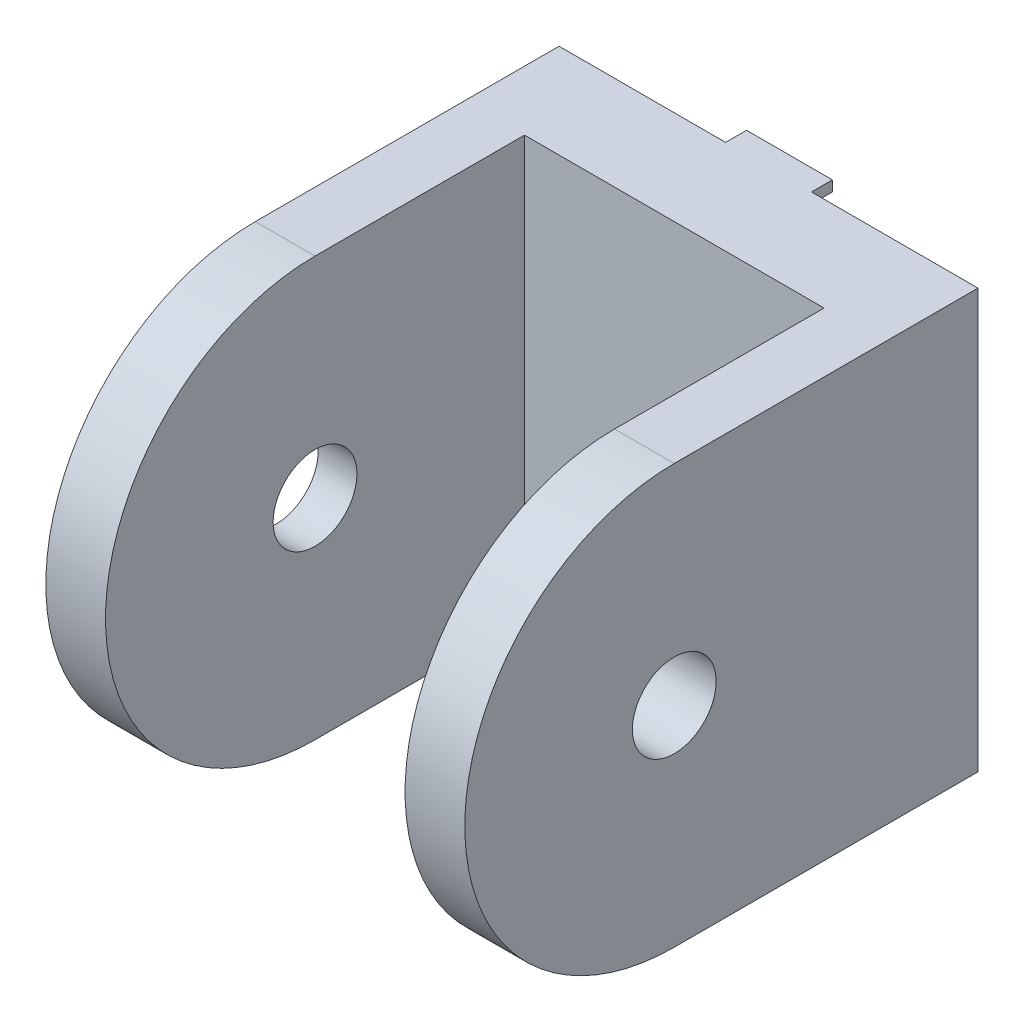
ISO-10303-21;
HEADER;
FILE_DESCRIPTION(('STEP AP214'),'2;1');
FILE_NAME('part.step','',(''),(''),'','','');
FILE_SCHEMA(('AUTOMOTIVE_DESIGN { 1 0 10303 214 1 1 1 1 }'));
ENDSEC;
DATA;
#1=APPLICATION_CONTEXT('core data for automotive mechanical design processes');
#2=APPLICATION_PROTOCOL_DEFINITION('international standard','automotive_design',2000,#1);
#3=PRODUCT_CONTEXT('',#1,'mechanical');
#4=PRODUCT('Part','Part','',(#3));
#5=PRODUCT_RELATED_PRODUCT_CATEGORY('part','',(#4));
#6=PRODUCT_DEFINITION_FORMATION('','',#4);
#7=PRODUCT_DEFINITION_CONTEXT('part definition',#1,'design');
#8=PRODUCT_DEFINITION('design','',#6,#7);
#9=PRODUCT_DEFINITION_SHAPE('','',#8);
#10=(LENGTH_UNIT() NAMED_UNIT(*) SI_UNIT(.MILLI.,.METRE.));
#11=(NAMED_UNIT(*) PLANE_ANGLE_UNIT() SI_UNIT($,.RADIAN.));
#12=(NAMED_UNIT(*) SI_UNIT($,.STERADIAN.) SOLID_ANGLE_UNIT());
#13=UNCERTAINTY_MEASURE_WITH_UNIT(LENGTH_MEASURE(1.E-05),#10,'distance_accuracy_value','');
#14=(GEOMETRIC_REPRESENTATION_CONTEXT(3) GLOBAL_UNCERTAINTY_ASSIGNED_CONTEXT((#13)) GLOBAL_UNIT_ASSIGNED_CONTEXT((#10,
#11,#12)) REPRESENTATION_CONTEXT('',''));
#15=CARTESIAN_POINT('',(0.,0.,0.));
#16=DIRECTION('',(0.,0.,1.));
#17=DIRECTION('',(1.,0.,0.));
#18=AXIS2_PLACEMENT_3D('',#15,#16,#17);
#19=CARTESIAN_POINT('',(20.,20.,0.));
#20=DIRECTION('',(0.,0.,-1.));
#21=DIRECTION('',(-1.,0.,0.));
#22=AXIS2_PLACEMENT_3D('',#19,#20,#21);
#23=PLANE('',#22);
#24=CARTESIAN_POINT('',(0.,0.,0.));
#25=DIRECTION('',(0.,0.,1.));
#26=DIRECTION('',(1.,0.,0.));
#27=AXIS2_PLACEMENT_3D('',#24,#25,#26);
#28=CIRCLE('',#27,4.);
#29=CARTESIAN_POINT('',(4.,0.,0.));
#30=VERTEX_POINT('',#29);
#31=EDGE_CURVE('E279',#30,#30,#28,.T.);
#32=ORIENTED_EDGE('',*,*,#31,.T.);
#33=EDGE_LOOP('',(#32));
#34=FACE_BOUND('',#33,.T.);
#35=DIRECTION('',(1.,0.,0.));
#36=VECTOR('',#35,1.);
#37=CARTESIAN_POINT('',(4.1,-19.,0.));
#38=LINE('',#37,#36);
#39=CARTESIAN_POINT('',(-4.1,-19.,0.));
#40=VERTEX_POINT('',#39);
#41=CARTESIAN_POINT('',(4.1,-19.,0.));
#42=VERTEX_POINT('',#41);
#43=EDGE_CURVE('E340',#40,#42,#38,.T.);
#44=ORIENTED_EDGE('',*,*,#43,.F.);
#45=DIRECTION('',(0.,1.,0.));
#46=VECTOR('',#45,1.);
#47=CARTESIAN_POINT('',(-4.1,-20.,0.));
#48=LINE('',#47,#46);
#49=CARTESIAN_POINT('',(-4.1,-20.,0.));
#50=VERTEX_POINT('',#49);
#51=EDGE_CURVE('E338',#50,#40,#48,.T.);
#52=ORIENTED_EDGE('',*,*,#51,.F.);
#53=DIRECTION('',(1.,0.,0.));
#54=VECTOR('',#53,1.);
#55=CARTESIAN_POINT('',(-20.,-20.,0.));
#56=LINE('',#55,#54);
#57=CARTESIAN_POINT('',(-20.,-20.,0.));
#58=VERTEX_POINT('',#57);
#59=EDGE_CURVE('E174',#58,#50,#56,.T.);
#60=ORIENTED_EDGE('',*,*,#59,.F.);
#61=DIRECTION('',(0.,-1.,0.));
#62=VECTOR('',#61,1.);
#63=CARTESIAN_POINT('',(-20.,-20.,0.));
#64=LINE('',#63,#62);
#65=CARTESIAN_POINT('',(-20.,20.,0.));
#66=VERTEX_POINT('',#65);
#67=EDGE_CURVE('E227',#66,#58,#64,.T.);
#68=ORIENTED_EDGE('',*,*,#67,.F.);
#69=DIRECTION('',(-1.,0.,0.));
#70=VECTOR('',#69,1.);
#71=CARTESIAN_POINT('',(-20.,20.,0.));
#72=LINE('',#71,#70);
#73=CARTESIAN_POINT('',(-4.1,20.,0.));
#74=VERTEX_POINT('',#73);
#75=EDGE_CURVE('E217',#74,#66,#72,.T.);
#76=ORIENTED_EDGE('',*,*,#75,.F.);
#77=DIRECTION('',(0.,1.,0.));
#78=VECTOR('',#77,1.);
#79=CARTESIAN_POINT('',(-4.1,20.,0.));
#80=LINE('',#79,#78);
#81=CARTESIAN_POINT('',(-4.1,19.,0.));
#82=VERTEX_POINT('',#81);
#83=EDGE_CURVE('E186',#82,#74,#80,.T.);
#84=ORIENTED_EDGE('',*,*,#83,.F.);
#85=DIRECTION('',(-1.,0.,0.));
#86=VECTOR('',#85,1.);
#87=CARTESIAN_POINT('',(4.1,19.,0.));
#88=LINE('',#87,#86);
#89=CARTESIAN_POINT('',(4.1,19.,0.));
#90=VERTEX_POINT('',#89);
#91=EDGE_CURVE('E60',#90,#82,#88,.T.);
#92=ORIENTED_EDGE('',*,*,#91,.F.);
#93=DIRECTION('',(0.,-1.,0.));
#94=VECTOR('',#93,1.);
#95=CARTESIAN_POINT('',(4.1,20.,0.));
#96=LINE('',#95,#94);
#97=CARTESIAN_POINT('',(4.1,20.,0.));
#98=VERTEX_POINT('',#97);
#99=EDGE_CURVE('E175',#98,#90,#96,.T.);
#100=ORIENTED_EDGE('',*,*,#99,.F.);
#101=CARTESIAN_POINT('',(20.,20.,0.));
#102=VERTEX_POINT('',#101);
#103=EDGE_CURVE('E220',#102,#98,#72,.T.);
#104=ORIENTED_EDGE('',*,*,#103,.F.);
#105=DIRECTION('',(0.,1.,0.));
#106=VECTOR('',#105,1.);
#107=CARTESIAN_POINT('',(20.,-20.,0.));
#108=LINE('',#107,#106);
#109=CARTESIAN_POINT('',(20.,-20.,0.));
#110=VERTEX_POINT('',#109);
#111=EDGE_CURVE('E221',#110,#102,#108,.T.);
#112=ORIENTED_EDGE('',*,*,#111,.F.);
#113=CARTESIAN_POINT('',(4.1,-20.,0.));
#114=VERTEX_POINT('',#113);
#115=EDGE_CURVE('E231',#114,#110,#56,.T.);
#116=ORIENTED_EDGE('',*,*,#115,.F.);
#117=DIRECTION('',(0.,-1.,0.));
#118=VECTOR('',#117,1.);
#119=CARTESIAN_POINT('',(4.1,-20.,0.));
#120=LINE('',#119,#118);
#121=EDGE_CURVE('E168',#42,#114,#120,.T.);
#122=ORIENTED_EDGE('',*,*,#121,.F.);
#123=EDGE_LOOP('',(#44,#52,#60,#68,#76,#84,#92,#100,#104,#112,#116,#122));
#124=FACE_BOUND('',#123,.T.);
#125=ADVANCED_FACE('F35',(#34,#124),#23,.T.);
#126=CARTESIAN_POINT('',(20.,0.,29.));
#127=DIRECTION('',(-1.,0.,0.));
#128=DIRECTION('',(0.,0.,1.));
#129=AXIS2_PLACEMENT_3D('',#126,#127,#128);
#130=CYLINDRICAL_SURFACE('',#129,4.);
#131=CARTESIAN_POINT('',(-14.3,0.,29.));
#132=DIRECTION('',(-1.,0.,0.));
#133=DIRECTION('',(0.,0.,1.));
#134=AXIS2_PLACEMENT_3D('',#131,#132,#133);
#135=CIRCLE('',#134,4.);
#136=CARTESIAN_POINT('',(-14.3,0.,33.));
#137=VERTEX_POINT('',#136);
#138=EDGE_CURVE('E264',#137,#137,#135,.T.);
#139=ORIENTED_EDGE('',*,*,#138,.F.);
#140=EDGE_LOOP('',(#139));
#141=FACE_BOUND('',#140,.T.);
#142=CARTESIAN_POINT('',(-18.,0.,29.));
#143=DIRECTION('',(-1.,0.,0.));
#144=DIRECTION('',(0.,0.,1.));
#145=AXIS2_PLACEMENT_3D('',#142,#143,#144);
#146=CIRCLE('',#145,4.);
#147=CARTESIAN_POINT('',(-18.,0.,33.));
#148=VERTEX_POINT('',#147);
#149=EDGE_CURVE('E266',#148,#148,#146,.F.);
#150=ORIENTED_EDGE('',*,*,#149,.F.);
#151=EDGE_LOOP('',(#150));
#152=FACE_BOUND('',#151,.T.);
#153=ADVANCED_FACE('F382',(#141,#152),#130,.F.);
#154=CARTESIAN_POINT('',(-20.,20.,9.));
#155=DIRECTION('',(0.,-1.,0.));
#156=DIRECTION('',(0.,0.,-1.));
#157=AXIS2_PLACEMENT_3D('',#154,#155,#156);
#158=PLANE('',#157);
#159=DIRECTION('',(1.,0.,0.));
#160=VECTOR('',#159,1.);
#161=CARTESIAN_POINT('',(-156.424873480094,20.,29.));
#162=LINE('',#161,#160);
#163=CARTESIAN_POINT('',(14.3,20.,29.));
#164=VERTEX_POINT('',#163);
#165=CARTESIAN_POINT('',(20.,20.,29.));
#166=VERTEX_POINT('',#165);
#167=EDGE_CURVE('E288',#164,#166,#162,.T.);
#168=ORIENTED_EDGE('',*,*,#167,.T.);
#169=DIRECTION('',(0.,0.,-1.));
#170=VECTOR('',#169,1.);
#171=CARTESIAN_POINT('',(20.,20.,9.));
#172=LINE('',#171,#170);
#173=EDGE_CURVE('E11',#166,#102,#172,.T.);
#174=ORIENTED_EDGE('',*,*,#173,.T.);
#175=ORIENTED_EDGE('',*,*,#103,.T.);
#176=DIRECTION('',(0.,0.,1.));
#177=VECTOR('',#176,1.);
#178=CARTESIAN_POINT('',(4.1,20.,-2.));
#179=LINE('',#178,#177);
#180=CARTESIAN_POINT('',(4.1,20.,-2.));
#181=VERTEX_POINT('',#180);
#182=EDGE_CURVE('E192',#181,#98,#179,.T.);
#183=ORIENTED_EDGE('',*,*,#182,.F.);
#184=DIRECTION('',(1.,0.,0.));
#185=VECTOR('',#184,1.);
#186=CARTESIAN_POINT('',(4.1,20.,-2.));
#187=LINE('',#186,#185);
#188=CARTESIAN_POINT('',(-4.1,20.,-2.));
#189=VERTEX_POINT('',#188);
#190=EDGE_CURVE('E190',#189,#181,#187,.T.);
#191=ORIENTED_EDGE('',*,*,#190,.F.);
#192=DIRECTION('',(0.,0.,1.));
#193=VECTOR('',#192,1.);
#194=CARTESIAN_POINT('',(-4.1,20.,-2.));
#195=LINE('',#194,#193);
#196=EDGE_CURVE('E203',#189,#74,#195,.T.);
#197=ORIENTED_EDGE('',*,*,#196,.T.);
#198=ORIENTED_EDGE('',*,*,#75,.T.);
#199=DIRECTION('',(0.,0.,-1.));
#200=VECTOR('',#199,1.);
#201=CARTESIAN_POINT('',(-20.,20.,9.));
#202=LINE('',#201,#200);
#203=CARTESIAN_POINT('',(-20.,20.,29.));
#204=VERTEX_POINT('',#203);
#205=EDGE_CURVE('E44',#204,#66,#202,.T.);
#206=ORIENTED_EDGE('',*,*,#205,.F.);
#207=CARTESIAN_POINT('',(-14.3,20.,29.));
#208=VERTEX_POINT('',#207);
#209=EDGE_CURVE('E291',#204,#208,#162,.T.);
#210=ORIENTED_EDGE('',*,*,#209,.T.);
#211=DIRECTION('',(0.,0.,-1.));
#212=VECTOR('',#211,1.);
#213=CARTESIAN_POINT('',(-14.3,20.,49.));
#214=LINE('',#213,#212);
#215=CARTESIAN_POINT('',(-14.3,20.,9.));
#216=VERTEX_POINT('',#215);
#217=EDGE_CURVE('E257',#208,#216,#214,.T.);
#218=ORIENTED_EDGE('',*,*,#217,.T.);
#219=DIRECTION('',(-1.,0.,0.));
#220=VECTOR('',#219,1.);
#221=CARTESIAN_POINT('',(-20.,20.,9.));
#222=LINE('',#221,#220);
#223=CARTESIAN_POINT('',(14.3,20.,9.));
#224=VERTEX_POINT('',#223);
#225=EDGE_CURVE('E233',#224,#216,#222,.T.);
#226=ORIENTED_EDGE('',*,*,#225,.F.);
#227=DIRECTION('',(0.,0.,-1.));
#228=VECTOR('',#227,1.);
#229=CARTESIAN_POINT('',(14.3,20.,49.));
#230=LINE('',#229,#228);
#231=EDGE_CURVE('E307',#164,#224,#230,.T.);
#232=ORIENTED_EDGE('',*,*,#231,.F.);
#233=EDGE_LOOP('',(#168,#174,#175,#183,#191,#197,#198,#206,#210,#218,#226,#232));
#234=FACE_BOUND('',#233,.T.);
#235=ADVANCED_FACE('F326',(#234),#158,.F.);
#236=CARTESIAN_POINT('',(20.,20.,9.));
#237=DIRECTION('',(0.,0.,-1.));
#238=DIRECTION('',(-1.,0.,0.));
#239=AXIS2_PLACEMENT_3D('',#236,#237,#238);
#240=PLANE('',#239);
#241=CARTESIAN_POINT('',(0.,0.,9.));
#242=DIRECTION('',(0.,0.,1.));
#243=DIRECTION('',(1.,0.,0.));
#244=AXIS2_PLACEMENT_3D('',#241,#242,#243);
#245=CIRCLE('',#244,4.);
#246=CARTESIAN_POINT('',(4.,0.,9.));
#247=VERTEX_POINT('',#246);
#248=EDGE_CURVE('E282',#247,#247,#245,.T.);
#249=ORIENTED_EDGE('',*,*,#248,.F.);
#250=EDGE_LOOP('',(#249));
#251=FACE_BOUND('',#250,.T.);
#252=DIRECTION('',(0.,-1.,0.));
#253=VECTOR('',#252,1.);
#254=CARTESIAN_POINT('',(14.3,-20.,9.));
#255=LINE('',#254,#253);
#256=CARTESIAN_POINT('',(14.3,-20.,9.));
#257=VERTEX_POINT('',#256);
#258=EDGE_CURVE('E303',#224,#257,#255,.T.);
#259=ORIENTED_EDGE('',*,*,#258,.F.);
#260=ORIENTED_EDGE('',*,*,#225,.T.);
#261=DIRECTION('',(0.,1.,0.));
#262=VECTOR('',#261,1.);
#263=CARTESIAN_POINT('',(-14.3,-20.,9.));
#264=LINE('',#263,#262);
#265=CARTESIAN_POINT('',(-14.3,-20.,9.));
#266=VERTEX_POINT('',#265);
#267=EDGE_CURVE('E244',#266,#216,#264,.T.);
#268=ORIENTED_EDGE('',*,*,#267,.F.);
#269=DIRECTION('',(1.,0.,0.));
#270=VECTOR('',#269,1.);
#271=CARTESIAN_POINT('',(-20.,-20.,9.));
#272=LINE('',#271,#270);
#273=EDGE_CURVE('E238',#266,#257,#272,.T.);
#274=ORIENTED_EDGE('',*,*,#273,.T.);
#275=EDGE_LOOP('',(#259,#260,#268,#274));
#276=FACE_BOUND('',#275,.T.);
#277=ADVANCED_FACE('F319',(#251,#276),#240,.F.);
#278=CARTESIAN_POINT('',(20.,-20.,9.));
#279=DIRECTION('',(-1.,0.,0.));
#280=DIRECTION('',(0.,0.,1.));
#281=AXIS2_PLACEMENT_3D('',#278,#279,#280);
#282=PLANE('',#281);
#283=CARTESIAN_POINT('',(20.,0.,29.));
#284=DIRECTION('',(-1.,0.,0.));
#285=DIRECTION('',(0.,0.,1.));
#286=AXIS2_PLACEMENT_3D('',#283,#284,#285);
#287=CIRCLE('',#286,4.);
#288=CARTESIAN_POINT('',(20.,0.,33.));
#289=VERTEX_POINT('',#288);
#290=EDGE_CURVE('E265',#289,#289,#287,.T.);
#291=ORIENTED_EDGE('',*,*,#290,.T.);
#292=EDGE_LOOP('',(#291));
#293=FACE_BOUND('',#292,.T.);
#294=CARTESIAN_POINT('',(20.,0.,29.));
#295=DIRECTION('',(-1.,0.,0.));
#296=DIRECTION('',(0.,0.,1.));
#297=AXIS2_PLACEMENT_3D('',#294,#295,#296);
#298=CIRCLE('',#297,20.);
#299=CARTESIAN_POINT('',(20.,-20.,29.));
#300=VERTEX_POINT('',#299);
#301=EDGE_CURVE('E298',#166,#300,#298,.F.);
#302=ORIENTED_EDGE('',*,*,#301,.T.);
#303=DIRECTION('',(0.,0.,-1.));
#304=VECTOR('',#303,1.);
#305=CARTESIAN_POINT('',(20.,-20.,9.));
#306=LINE('',#305,#304);
#307=EDGE_CURVE('E234',#300,#110,#306,.T.);
#308=ORIENTED_EDGE('',*,*,#307,.T.);
#309=ORIENTED_EDGE('',*,*,#111,.T.);
#310=ORIENTED_EDGE('',*,*,#173,.F.);
#311=EDGE_LOOP('',(#302,#308,#309,#310));
#312=FACE_BOUND('',#311,.T.);
#313=ADVANCED_FACE('F37',(#293,#312),#282,.F.);
#314=CARTESIAN_POINT('',(-20.,-20.,9.));
#315=DIRECTION('',(1.,0.,0.));
#316=DIRECTION('',(0.,0.,-1.));
#317=AXIS2_PLACEMENT_3D('',#314,#315,#316);
#318=PLANE('',#317);
#319=CARTESIAN_POINT('',(-20.,0.,29.));
#320=DIRECTION('',(-1.,0.,0.));
#321=DIRECTION('',(0.,0.,1.));
#322=AXIS2_PLACEMENT_3D('',#319,#320,#321);
#323=CIRCLE('',#322,8.);
#324=CARTESIAN_POINT('',(-20.,0.,37.));
#325=VERTEX_POINT('',#324);
#326=EDGE_CURVE('E274',#325,#325,#323,.T.);
#327=ORIENTED_EDGE('',*,*,#326,.F.);
#328=EDGE_LOOP('',(#327));
#329=FACE_BOUND('',#328,.T.);
#330=DIRECTION('',(0.,0.,-1.));
#331=VECTOR('',#330,1.);
#332=CARTESIAN_POINT('',(-20.,-20.,9.));
#333=LINE('',#332,#331);
#334=CARTESIAN_POINT('',(-20.,-20.,29.));
#335=VERTEX_POINT('',#334);
#336=EDGE_CURVE('E237',#335,#58,#333,.T.);
#337=ORIENTED_EDGE('',*,*,#336,.F.);
#338=CARTESIAN_POINT('',(-20.,0.,29.));
#339=DIRECTION('',(1.,0.,0.));
#340=DIRECTION('',(0.,0.,-1.));
#341=AXIS2_PLACEMENT_3D('',#338,#339,#340);
#342=CIRCLE('',#341,20.);
#343=EDGE_CURVE('E301',#335,#204,#342,.F.);
#344=ORIENTED_EDGE('',*,*,#343,.T.);
#345=ORIENTED_EDGE('',*,*,#205,.T.);
#346=ORIENTED_EDGE('',*,*,#67,.T.);
#347=EDGE_LOOP('',(#337,#344,#345,#346));
#348=FACE_BOUND('',#347,.T.);
#349=ADVANCED_FACE('F335',(#329,#348),#318,.F.);
#350=CARTESIAN_POINT('',(-20.,-20.,9.));
#351=DIRECTION('',(0.,1.,0.));
#352=DIRECTION('',(0.,0.,1.));
#353=AXIS2_PLACEMENT_3D('',#350,#351,#352);
#354=PLANE('',#353);
#355=ORIENTED_EDGE('',*,*,#307,.F.);
#356=DIRECTION('',(1.,0.,0.));
#357=VECTOR('',#356,1.);
#358=CARTESIAN_POINT('',(-156.424873480094,-20.,29.));
#359=LINE('',#358,#357);
#360=CARTESIAN_POINT('',(14.3,-20.,29.));
#361=VERTEX_POINT('',#360);
#362=EDGE_CURVE('E287',#361,#300,#359,.T.);
#363=ORIENTED_EDGE('',*,*,#362,.F.);
#364=DIRECTION('',(0.,0.,-1.));
#365=VECTOR('',#364,1.);
#366=CARTESIAN_POINT('',(14.3,-20.,49.));
#367=LINE('',#366,#365);
#368=EDGE_CURVE('E306',#361,#257,#367,.T.);
#369=ORIENTED_EDGE('',*,*,#368,.T.);
#370=ORIENTED_EDGE('',*,*,#273,.F.);
#371=DIRECTION('',(0.,0.,-1.));
#372=VECTOR('',#371,1.);
#373=CARTESIAN_POINT('',(-14.3,-20.,49.));
#374=LINE('',#373,#372);
#375=CARTESIAN_POINT('',(-14.3,-20.,29.));
#376=VERTEX_POINT('',#375);
#377=EDGE_CURVE('E259',#376,#266,#374,.T.);
#378=ORIENTED_EDGE('',*,*,#377,.F.);
#379=EDGE_CURVE('E292',#335,#376,#359,.T.);
#380=ORIENTED_EDGE('',*,*,#379,.F.);
#381=ORIENTED_EDGE('',*,*,#336,.T.);
#382=ORIENTED_EDGE('',*,*,#59,.T.);
#383=DIRECTION('',(0.,0.,1.));
#384=VECTOR('',#383,1.);
#385=CARTESIAN_POINT('',(-4.1,-20.,-2.));
#386=LINE('',#385,#384);
#387=CARTESIAN_POINT('',(-4.1,-20.,-2.));
#388=VERTEX_POINT('',#387);
#389=EDGE_CURVE('E153',#388,#50,#386,.T.);
#390=ORIENTED_EDGE('',*,*,#389,.F.);
#391=DIRECTION('',(-1.,0.,0.));
#392=VECTOR('',#391,1.);
#393=CARTESIAN_POINT('',(4.1,-20.,-2.));
#394=LINE('',#393,#392);
#395=CARTESIAN_POINT('',(4.1,-20.,-2.));
#396=VERTEX_POINT('',#395);
#397=EDGE_CURVE('E160',#396,#388,#394,.T.);
#398=ORIENTED_EDGE('',*,*,#397,.F.);
#399=DIRECTION('',(0.,0.,1.));
#400=VECTOR('',#399,1.);
#401=CARTESIAN_POINT('',(4.1,-20.,-2.));
#402=LINE('',#401,#400);
#403=EDGE_CURVE('E347',#396,#114,#402,.T.);
#404=ORIENTED_EDGE('',*,*,#403,.T.);
#405=ORIENTED_EDGE('',*,*,#115,.T.);
#406=EDGE_LOOP('',(#355,#363,#369,#370,#378,#380,#381,#382,#390,#398,#404,#405));
#407=FACE_BOUND('',#406,.T.);
#408=ADVANCED_FACE('F172',(#407),#354,.F.);
#409=CARTESIAN_POINT('',(-14.3,-20.,49.));
#410=DIRECTION('',(-1.,0.,0.));
#411=DIRECTION('',(0.,0.,1.));
#412=AXIS2_PLACEMENT_3D('',#409,#410,#411);
#413=PLANE('',#412);
#414=ORIENTED_EDGE('',*,*,#138,.T.);
#415=EDGE_LOOP('',(#414));
#416=FACE_BOUND('',#415,.T.);
#417=CARTESIAN_POINT('',(-14.3,0.,29.));
#418=DIRECTION('',(-1.,0.,0.));
#419=DIRECTION('',(0.,0.,1.));
#420=AXIS2_PLACEMENT_3D('',#417,#418,#419);
#421=CIRCLE('',#420,20.);
#422=EDGE_CURVE('E297',#208,#376,#421,.F.);
#423=ORIENTED_EDGE('',*,*,#422,.T.);
#424=ORIENTED_EDGE('',*,*,#377,.T.);
#425=ORIENTED_EDGE('',*,*,#267,.T.);
#426=ORIENTED_EDGE('',*,*,#217,.F.);
#427=EDGE_LOOP('',(#423,#424,#425,#426));
#428=FACE_BOUND('',#427,.T.);
#429=ADVANCED_FACE('F315',(#416,#428),#413,.F.);
#430=CARTESIAN_POINT('',(14.3,-20.,49.));
#431=DIRECTION('',(1.,0.,0.));
#432=DIRECTION('',(0.,0.,-1.));
#433=AXIS2_PLACEMENT_3D('',#430,#431,#432);
#434=PLANE('',#433);
#435=CARTESIAN_POINT('',(14.3,0.,29.));
#436=DIRECTION('',(1.,0.,0.));
#437=DIRECTION('',(0.,0.,-1.));
#438=AXIS2_PLACEMENT_3D('',#435,#436,#437);
#439=CIRCLE('',#438,4.);
#440=CARTESIAN_POINT('',(14.3,0.,25.));
#441=VERTEX_POINT('',#440);
#442=EDGE_CURVE('E262',#441,#441,#439,.T.);
#443=ORIENTED_EDGE('',*,*,#442,.T.);
#444=EDGE_LOOP('',(#443));
#445=FACE_BOUND('',#444,.T.);
#446=ORIENTED_EDGE('',*,*,#368,.F.);
#447=CARTESIAN_POINT('',(14.3,0.,29.));
#448=DIRECTION('',(1.,0.,0.));
#449=DIRECTION('',(0.,0.,-1.));
#450=AXIS2_PLACEMENT_3D('',#447,#448,#449);
#451=CIRCLE('',#450,20.);
#452=EDGE_CURVE('E295',#361,#164,#451,.F.);
#453=ORIENTED_EDGE('',*,*,#452,.T.);
#454=ORIENTED_EDGE('',*,*,#231,.T.);
#455=ORIENTED_EDGE('',*,*,#258,.T.);
#456=EDGE_LOOP('',(#446,#453,#454,#455));
#457=FACE_BOUND('',#456,.T.);
#458=ADVANCED_FACE('F324',(#445,#457),#434,.F.);
#459=CARTESIAN_POINT('',(-156.424873480094,0.,29.));
#460=DIRECTION('',(1.,0.,0.));
#461=DIRECTION('',(0.,0.,-1.));
#462=AXIS2_PLACEMENT_3D('',#459,#460,#461);
#463=CYLINDRICAL_SURFACE('',#462,20.);
#464=ORIENTED_EDGE('',*,*,#362,.T.);
#465=ORIENTED_EDGE('',*,*,#301,.F.);
#466=ORIENTED_EDGE('',*,*,#167,.F.);
#467=ORIENTED_EDGE('',*,*,#452,.F.);
#468=EDGE_LOOP('',(#464,#465,#466,#467));
#469=FACE_BOUND('',#468,.T.);
#470=ADVANCED_FACE('F358',(#469),#463,.T.);
#471=ORIENTED_EDGE('',*,*,#343,.F.);
#472=ORIENTED_EDGE('',*,*,#379,.T.);
#473=ORIENTED_EDGE('',*,*,#422,.F.);
#474=ORIENTED_EDGE('',*,*,#209,.F.);
#475=EDGE_LOOP('',(#471,#472,#473,#474));
#476=FACE_BOUND('',#475,.T.);
#477=ADVANCED_FACE('F331',(#476),#463,.T.);
#478=ORIENTED_EDGE('',*,*,#290,.F.);
#479=EDGE_LOOP('',(#478));
#480=FACE_BOUND('',#479,.T.);
#481=ORIENTED_EDGE('',*,*,#442,.F.);
#482=EDGE_LOOP('',(#481));
#483=FACE_BOUND('',#482,.T.);
#484=ADVANCED_FACE('F391',(#480,#483),#130,.F.);
#485=CARTESIAN_POINT('',(-18.,0.,29.));
#486=DIRECTION('',(-1.,0.,0.));
#487=DIRECTION('',(0.,0.,1.));
#488=AXIS2_PLACEMENT_3D('',#485,#486,#487);
#489=PLANE('',#488);
#490=CARTESIAN_POINT('',(-18.,0.,29.));
#491=DIRECTION('',(-1.,0.,0.));
#492=DIRECTION('',(0.,0.,1.));
#493=AXIS2_PLACEMENT_3D('',#490,#491,#492);
#494=CIRCLE('',#493,8.);
#495=CARTESIAN_POINT('',(-18.,0.,37.));
#496=VERTEX_POINT('',#495);
#497=EDGE_CURVE('E268',#496,#496,#494,.T.);
#498=ORIENTED_EDGE('',*,*,#497,.T.);
#499=EDGE_LOOP('',(#498));
#500=FACE_BOUND('',#499,.T.);
#501=ORIENTED_EDGE('',*,*,#149,.T.);
#502=EDGE_LOOP('',(#501));
#503=FACE_BOUND('',#502,.T.);
#504=ADVANCED_FACE('F402',(#500,#503),#489,.T.);
#505=CARTESIAN_POINT('',(-18.,0.,29.));
#506=DIRECTION('',(-1.,0.,0.));
#507=DIRECTION('',(0.,0.,1.));
#508=AXIS2_PLACEMENT_3D('',#505,#506,#507);
#509=CYLINDRICAL_SURFACE('',#508,8.);
#510=ORIENTED_EDGE('',*,*,#497,.F.);
#511=EDGE_LOOP('',(#510));
#512=FACE_BOUND('',#511,.T.);
#513=ORIENTED_EDGE('',*,*,#326,.T.);
#514=EDGE_LOOP('',(#513));
#515=FACE_BOUND('',#514,.T.);
#516=ADVANCED_FACE('F371',(#512,#515),#509,.F.);
#517=CARTESIAN_POINT('',(0.,0.,0.));
#518=DIRECTION('',(0.,0.,1.));
#519=DIRECTION('',(1.,0.,0.));
#520=AXIS2_PLACEMENT_3D('',#517,#518,#519);
#521=CYLINDRICAL_SURFACE('',#520,4.);
#522=ORIENTED_EDGE('',*,*,#31,.F.);
#523=EDGE_LOOP('',(#522));
#524=FACE_BOUND('',#523,.T.);
#525=ORIENTED_EDGE('',*,*,#248,.T.);
#526=EDGE_LOOP('',(#525));
#527=FACE_BOUND('',#526,.T.);
#528=ADVANCED_FACE('F368',(#524,#527),#521,.F.);
#529=CARTESIAN_POINT('',(4.1,20.,-2.));
#530=DIRECTION('',(-1.,0.,0.));
#531=DIRECTION('',(0.,-1.,0.));
#532=AXIS2_PLACEMENT_3D('',#529,#530,#531);
#533=PLANE('',#532);
#534=ORIENTED_EDGE('',*,*,#99,.T.);
#535=DIRECTION('',(0.,0.,1.));
#536=VECTOR('',#535,1.);
#537=CARTESIAN_POINT('',(4.1,19.,-2.));
#538=LINE('',#537,#536);
#539=CARTESIAN_POINT('',(4.1,19.,-2.));
#540=VERTEX_POINT('',#539);
#541=EDGE_CURVE('E209',#540,#90,#538,.T.);
#542=ORIENTED_EDGE('',*,*,#541,.F.);
#543=DIRECTION('',(0.,-1.,0.));
#544=VECTOR('',#543,1.);
#545=CARTESIAN_POINT('',(4.1,20.,-2.));
#546=LINE('',#545,#544);
#547=EDGE_CURVE('E182',#181,#540,#546,.T.);
#548=ORIENTED_EDGE('',*,*,#547,.F.);
#549=ORIENTED_EDGE('',*,*,#182,.T.);
#550=EDGE_LOOP('',(#534,#542,#548,#549));
#551=FACE_BOUND('',#550,.T.);
#552=ADVANCED_FACE('F361',(#551),#533,.F.);
#553=CARTESIAN_POINT('',(4.1,19.,-2.));
#554=DIRECTION('',(0.,1.,0.));
#555=DIRECTION('',(0.,0.,1.));
#556=AXIS2_PLACEMENT_3D('',#553,#554,#555);
#557=PLANE('',#556);
#558=ORIENTED_EDGE('',*,*,#91,.T.);
#559=DIRECTION('',(0.,0.,1.));
#560=VECTOR('',#559,1.);
#561=CARTESIAN_POINT('',(-4.1,19.,-2.));
#562=LINE('',#561,#560);
#563=CARTESIAN_POINT('',(-4.1,19.,-2.));
#564=VERTEX_POINT('',#563);
#565=EDGE_CURVE('E196',#564,#82,#562,.T.);
#566=ORIENTED_EDGE('',*,*,#565,.F.);
#567=DIRECTION('',(-1.,0.,0.));
#568=VECTOR('',#567,1.);
#569=CARTESIAN_POINT('',(4.1,19.,-2.));
#570=LINE('',#569,#568);
#571=EDGE_CURVE('E185',#540,#564,#570,.T.);
#572=ORIENTED_EDGE('',*,*,#571,.F.);
#573=ORIENTED_EDGE('',*,*,#541,.T.);
#574=EDGE_LOOP('',(#558,#566,#572,#573));
#575=FACE_BOUND('',#574,.T.);
#576=ADVANCED_FACE('F491',(#575),#557,.F.);
#577=CARTESIAN_POINT('',(-4.1,20.,-2.));
#578=DIRECTION('',(1.,0.,0.));
#579=DIRECTION('',(0.,1.,0.));
#580=AXIS2_PLACEMENT_3D('',#577,#578,#579);
#581=PLANE('',#580);
#582=ORIENTED_EDGE('',*,*,#83,.T.);
#583=ORIENTED_EDGE('',*,*,#196,.F.);
#584=DIRECTION('',(0.,1.,0.));
#585=VECTOR('',#584,1.);
#586=CARTESIAN_POINT('',(-4.1,20.,-2.));
#587=LINE('',#586,#585);
#588=EDGE_CURVE('E188',#564,#189,#587,.T.);
#589=ORIENTED_EDGE('',*,*,#588,.F.);
#590=ORIENTED_EDGE('',*,*,#565,.T.);
#591=EDGE_LOOP('',(#582,#583,#589,#590));
#592=FACE_BOUND('',#591,.T.);
#593=ADVANCED_FACE('F500',(#592),#581,.F.);
#594=CARTESIAN_POINT('',(4.1,19.,-2.));
#595=DIRECTION('',(0.,0.,-1.));
#596=DIRECTION('',(-1.,0.,0.));
#597=AXIS2_PLACEMENT_3D('',#594,#595,#596);
#598=PLANE('',#597);
#599=ORIENTED_EDGE('',*,*,#547,.T.);
#600=ORIENTED_EDGE('',*,*,#571,.T.);
#601=ORIENTED_EDGE('',*,*,#588,.T.);
#602=ORIENTED_EDGE('',*,*,#190,.T.);
#603=EDGE_LOOP('',(#599,#600,#601,#602));
#604=FACE_BOUND('',#603,.T.);
#605=ADVANCED_FACE('F509',(#604),#598,.T.);
#606=CARTESIAN_POINT('',(-4.1,-20.,-2.));
#607=DIRECTION('',(1.,0.,0.));
#608=DIRECTION('',(0.,1.,0.));
#609=AXIS2_PLACEMENT_3D('',#606,#607,#608);
#610=PLANE('',#609);
#611=ORIENTED_EDGE('',*,*,#51,.T.);
#612=DIRECTION('',(0.,0.,1.));
#613=VECTOR('',#612,1.);
#614=CARTESIAN_POINT('',(-4.1,-19.,-2.));
#615=LINE('',#614,#613);
#616=CARTESIAN_POINT('',(-4.1,-19.,-2.));
#617=VERTEX_POINT('',#616);
#618=EDGE_CURVE('E156',#617,#40,#615,.T.);
#619=ORIENTED_EDGE('',*,*,#618,.F.);
#620=DIRECTION('',(0.,1.,0.));
#621=VECTOR('',#620,1.);
#622=CARTESIAN_POINT('',(-4.1,-20.,-2.));
#623=LINE('',#622,#621);
#624=EDGE_CURVE('E149',#388,#617,#623,.T.);
#625=ORIENTED_EDGE('',*,*,#624,.F.);
#626=ORIENTED_EDGE('',*,*,#389,.T.);
#627=EDGE_LOOP('',(#611,#619,#625,#626));
#628=FACE_BOUND('',#627,.T.);
#629=ADVANCED_FACE('F151',(#628),#610,.F.);
#630=CARTESIAN_POINT('',(4.1,-19.,-2.));
#631=DIRECTION('',(0.,-1.,0.));
#632=DIRECTION('',(0.,0.,-1.));
#633=AXIS2_PLACEMENT_3D('',#630,#631,#632);
#634=PLANE('',#633);
#635=ORIENTED_EDGE('',*,*,#43,.T.);
#636=DIRECTION('',(0.,0.,1.));
#637=VECTOR('',#636,1.);
#638=CARTESIAN_POINT('',(4.1,-19.,-2.));
#639=LINE('',#638,#637);
#640=CARTESIAN_POINT('',(4.1,-19.,-2.));
#641=VERTEX_POINT('',#640);
#642=EDGE_CURVE('E52',#641,#42,#639,.T.);
#643=ORIENTED_EDGE('',*,*,#642,.F.);
#644=DIRECTION('',(1.,0.,0.));
#645=VECTOR('',#644,1.);
#646=CARTESIAN_POINT('',(4.1,-19.,-2.));
#647=LINE('',#646,#645);
#648=EDGE_CURVE('E159',#617,#641,#647,.T.);
#649=ORIENTED_EDGE('',*,*,#648,.F.);
#650=ORIENTED_EDGE('',*,*,#618,.T.);
#651=EDGE_LOOP('',(#635,#643,#649,#650));
#652=FACE_BOUND('',#651,.T.);
#653=ADVANCED_FACE('F350',(#652),#634,.F.);
#654=CARTESIAN_POINT('',(4.1,-20.,-2.));
#655=DIRECTION('',(-1.,0.,0.));
#656=DIRECTION('',(0.,-1.,0.));
#657=AXIS2_PLACEMENT_3D('',#654,#655,#656);
#658=PLANE('',#657);
#659=ORIENTED_EDGE('',*,*,#121,.T.);
#660=ORIENTED_EDGE('',*,*,#403,.F.);
#661=DIRECTION('',(0.,-1.,0.));
#662=VECTOR('',#661,1.);
#663=CARTESIAN_POINT('',(4.1,-20.,-2.));
#664=LINE('',#663,#662);
#665=EDGE_CURVE('E164',#641,#396,#664,.T.);
#666=ORIENTED_EDGE('',*,*,#665,.F.);
#667=ORIENTED_EDGE('',*,*,#642,.T.);
#668=EDGE_LOOP('',(#659,#660,#666,#667));
#669=FACE_BOUND('',#668,.T.);
#670=ADVANCED_FACE('F351',(#669),#658,.F.);
#671=CARTESIAN_POINT('',(-4.1,-20.,-2.));
#672=DIRECTION('',(0.,0.,-1.));
#673=DIRECTION('',(-1.,0.,0.));
#674=AXIS2_PLACEMENT_3D('',#671,#672,#673);
#675=PLANE('',#674);
#676=ORIENTED_EDGE('',*,*,#397,.T.);
#677=ORIENTED_EDGE('',*,*,#624,.T.);
#678=ORIENTED_EDGE('',*,*,#648,.T.);
#679=ORIENTED_EDGE('',*,*,#665,.T.);
#680=EDGE_LOOP('',(#676,#677,#678,#679));
#681=FACE_BOUND('',#680,.T.);
#682=ADVANCED_FACE('F163',(#681),#675,.T.);
#683=CLOSED_SHELL('',(#125,#153,#235,#277,#313,#349,#408,#429,#458,#470,#477,#484,#504,#516,
#528,#552,#576,#593,#605,#629,#653,#670,#682));
#684=MANIFOLD_SOLID_BREP('B2',#683);
#685=ADVANCED_BREP_SHAPE_REPRESENTATION('',(#18,#684),#14);
#686=SHAPE_DEFINITION_REPRESENTATION(#9,#685);
ENDSEC;
END-ISO-10303-21;
